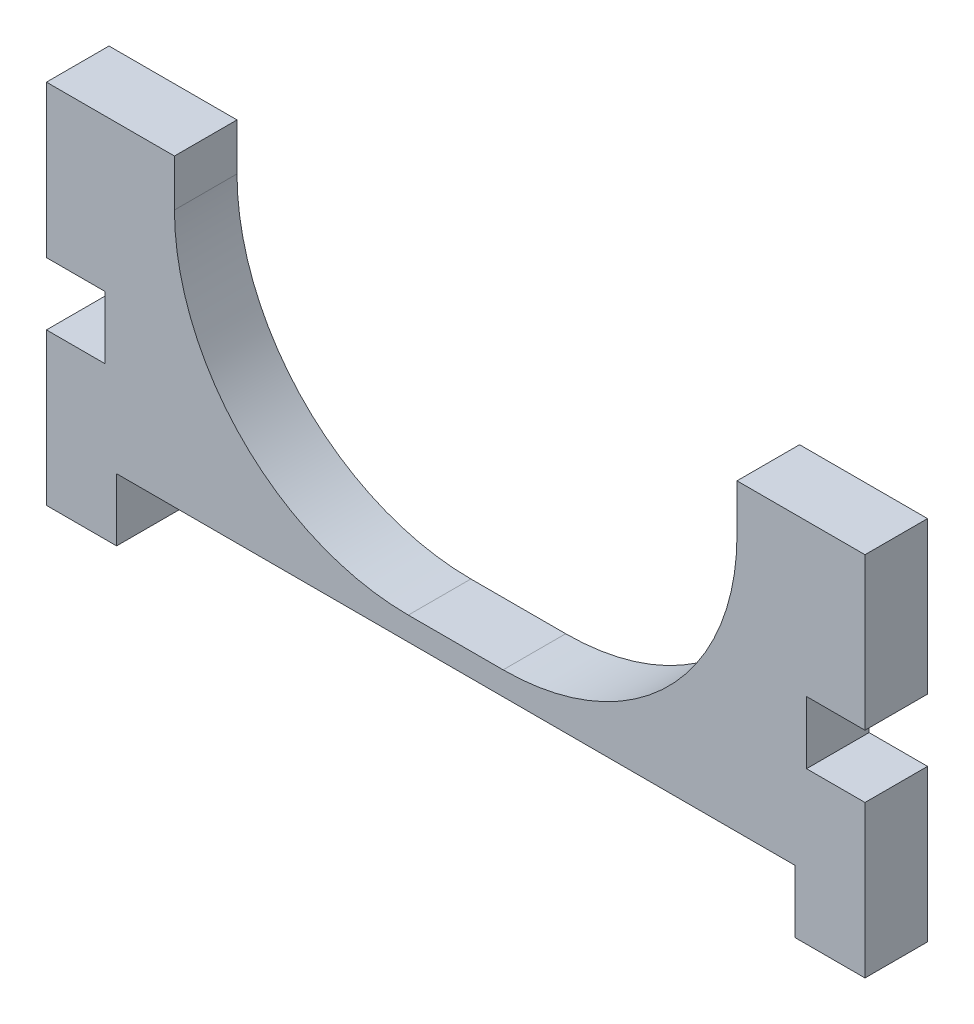
ISO-10303-21;
HEADER;
FILE_DESCRIPTION(('STEP AP214'),'2;1');
FILE_NAME('part.step','',(''),(''),'','','');
FILE_SCHEMA(('AUTOMOTIVE_DESIGN { 1 0 10303 214 1 1 1 1 }'));
ENDSEC;
DATA;
#1=APPLICATION_CONTEXT('core data for automotive mechanical design processes');
#2=APPLICATION_PROTOCOL_DEFINITION('international standard','automotive_design',2000,#1);
#3=PRODUCT_CONTEXT('',#1,'mechanical');
#4=PRODUCT('Part','Part','',(#3));
#5=PRODUCT_RELATED_PRODUCT_CATEGORY('part','',(#4));
#6=PRODUCT_DEFINITION_FORMATION('','',#4);
#7=PRODUCT_DEFINITION_CONTEXT('part definition',#1,'design');
#8=PRODUCT_DEFINITION('design','',#6,#7);
#9=PRODUCT_DEFINITION_SHAPE('','',#8);
#10=(LENGTH_UNIT() NAMED_UNIT(*) SI_UNIT(.MILLI.,.METRE.));
#11=(NAMED_UNIT(*) PLANE_ANGLE_UNIT() SI_UNIT($,.RADIAN.));
#12=(NAMED_UNIT(*) SI_UNIT($,.STERADIAN.) SOLID_ANGLE_UNIT());
#13=UNCERTAINTY_MEASURE_WITH_UNIT(LENGTH_MEASURE(1.E-05),#10,'distance_accuracy_value','');
#14=(GEOMETRIC_REPRESENTATION_CONTEXT(3) GLOBAL_UNCERTAINTY_ASSIGNED_CONTEXT((#13)) GLOBAL_UNIT_ASSIGNED_CONTEXT((#10,
#11,#12)) REPRESENTATION_CONTEXT('',''));
#15=CARTESIAN_POINT('',(0.,0.,0.));
#16=DIRECTION('',(0.,0.,1.));
#17=DIRECTION('',(1.,0.,0.));
#18=AXIS2_PLACEMENT_3D('',#15,#16,#17);
#19=CARTESIAN_POINT('',(39.055,27.35,5.35));
#20=DIRECTION('',(0.,0.,-1.));
#21=DIRECTION('',(-1.,0.,0.));
#22=AXIS2_PLACEMENT_3D('',#19,#20,#21);
#23=CYLINDRICAL_SURFACE('',#22,20.);
#24=CARTESIAN_POINT('',(39.055,27.35,0.));
#25=DIRECTION('',(0.,0.,-1.));
#26=DIRECTION('',(-1.,0.,0.));
#27=AXIS2_PLACEMENT_3D('',#24,#25,#26);
#28=CIRCLE('',#27,20.);
#29=CARTESIAN_POINT('',(59.055,27.35,0.));
#30=VERTEX_POINT('',#29);
#31=CARTESIAN_POINT('',(39.055,7.35000000000001,0.));
#32=VERTEX_POINT('',#31);
#33=EDGE_CURVE('E213',#30,#32,#28,.T.);
#34=ORIENTED_EDGE('',*,*,#33,.T.);
#35=DIRECTION('',(0.,0.,-1.));
#36=VECTOR('',#35,1.);
#37=CARTESIAN_POINT('',(39.055,7.35000000000001,5.35));
#38=LINE('',#37,#36);
#39=CARTESIAN_POINT('',(39.055,7.35000000000001,5.35));
#40=VERTEX_POINT('',#39);
#41=EDGE_CURVE('E11',#40,#32,#38,.T.);
#42=ORIENTED_EDGE('',*,*,#41,.F.);
#43=CARTESIAN_POINT('',(39.055,27.35,5.35));
#44=DIRECTION('',(0.,0.,-1.));
#45=DIRECTION('',(-1.,0.,0.));
#46=AXIS2_PLACEMENT_3D('',#43,#44,#45);
#47=CIRCLE('',#46,20.);
#48=CARTESIAN_POINT('',(59.055,27.35,5.35));
#49=VERTEX_POINT('',#48);
#50=EDGE_CURVE('E255',#49,#40,#47,.T.);
#51=ORIENTED_EDGE('',*,*,#50,.F.);
#52=DIRECTION('',(0.,0.,-1.));
#53=VECTOR('',#52,1.);
#54=CARTESIAN_POINT('',(59.055,27.35,5.35));
#55=LINE('',#54,#53);
#56=EDGE_CURVE('E209',#49,#30,#55,.T.);
#57=ORIENTED_EDGE('',*,*,#56,.T.);
#58=EDGE_LOOP('',(#34,#42,#51,#57));
#59=FACE_BOUND('',#58,.T.);
#60=ADVANCED_FACE('F33',(#59),#23,.F.);
#61=CARTESIAN_POINT('',(39.055,7.35000000000001,5.35));
#62=DIRECTION('',(0.,-1.,0.));
#63=DIRECTION('',(0.,0.,-1.));
#64=AXIS2_PLACEMENT_3D('',#61,#62,#63);
#65=PLANE('',#64);
#66=DIRECTION('',(-1.,0.,0.));
#67=VECTOR('',#66,1.);
#68=CARTESIAN_POINT('',(39.055,7.35000000000001,0.));
#69=LINE('',#68,#67);
#70=CARTESIAN_POINT('',(30.945,7.35,0.));
#71=VERTEX_POINT('',#70);
#72=EDGE_CURVE('E216',#32,#71,#69,.T.);
#73=ORIENTED_EDGE('',*,*,#72,.T.);
#74=DIRECTION('',(0.,0.,-1.));
#75=VECTOR('',#74,1.);
#76=CARTESIAN_POINT('',(30.945,7.35,5.35));
#77=LINE('',#76,#75);
#78=CARTESIAN_POINT('',(30.945,7.35,5.35));
#79=VERTEX_POINT('',#78);
#80=EDGE_CURVE('E41',#79,#71,#77,.T.);
#81=ORIENTED_EDGE('',*,*,#80,.F.);
#82=DIRECTION('',(-1.,0.,0.));
#83=VECTOR('',#82,1.);
#84=CARTESIAN_POINT('',(39.055,7.35000000000001,5.35));
#85=LINE('',#84,#83);
#86=EDGE_CURVE('E134',#40,#79,#85,.T.);
#87=ORIENTED_EDGE('',*,*,#86,.F.);
#88=ORIENTED_EDGE('',*,*,#41,.T.);
#89=EDGE_LOOP('',(#73,#81,#87,#88));
#90=FACE_BOUND('',#89,.T.);
#91=ADVANCED_FACE('F383',(#90),#65,.F.);
#92=CARTESIAN_POINT('',(30.945,27.35,5.35));
#93=DIRECTION('',(0.,0.,-1.));
#94=DIRECTION('',(-1.,0.,0.));
#95=AXIS2_PLACEMENT_3D('',#92,#93,#94);
#96=CYLINDRICAL_SURFACE('',#95,20.);
#97=CARTESIAN_POINT('',(30.945,27.35,0.));
#98=DIRECTION('',(0.,0.,-1.));
#99=DIRECTION('',(1.,0.,0.));
#100=AXIS2_PLACEMENT_3D('',#97,#98,#99);
#101=CIRCLE('',#100,20.);
#102=CARTESIAN_POINT('',(10.945,27.35,0.));
#103=VERTEX_POINT('',#102);
#104=EDGE_CURVE('E218',#71,#103,#101,.T.);
#105=ORIENTED_EDGE('',*,*,#104,.T.);
#106=DIRECTION('',(0.,0.,-1.));
#107=VECTOR('',#106,1.);
#108=CARTESIAN_POINT('',(10.945,27.35,5.35));
#109=LINE('',#108,#107);
#110=CARTESIAN_POINT('',(10.945,27.35,5.35));
#111=VERTEX_POINT('',#110);
#112=EDGE_CURVE('E304',#111,#103,#109,.T.);
#113=ORIENTED_EDGE('',*,*,#112,.F.);
#114=CARTESIAN_POINT('',(30.945,27.35,5.35));
#115=DIRECTION('',(0.,0.,-1.));
#116=DIRECTION('',(1.,0.,0.));
#117=AXIS2_PLACEMENT_3D('',#114,#115,#116);
#118=CIRCLE('',#117,20.);
#119=EDGE_CURVE('E312',#79,#111,#118,.T.);
#120=ORIENTED_EDGE('',*,*,#119,.F.);
#121=ORIENTED_EDGE('',*,*,#80,.T.);
#122=EDGE_LOOP('',(#105,#113,#120,#121));
#123=FACE_BOUND('',#122,.T.);
#124=ADVANCED_FACE('F310',(#123),#96,.F.);
#125=CARTESIAN_POINT('',(10.945,27.35,5.35));
#126=DIRECTION('',(-1.,0.,0.));
#127=DIRECTION('',(0.,0.,1.));
#128=AXIS2_PLACEMENT_3D('',#125,#126,#127);
#129=PLANE('',#128);
#130=DIRECTION('',(0.,1.,0.));
#131=VECTOR('',#130,1.);
#132=CARTESIAN_POINT('',(10.945,27.35,0.));
#133=LINE('',#132,#131);
#134=CARTESIAN_POINT('',(10.945,31.35,0.));
#135=VERTEX_POINT('',#134);
#136=EDGE_CURVE('E220',#103,#135,#133,.T.);
#137=ORIENTED_EDGE('',*,*,#136,.T.);
#138=DIRECTION('',(0.,0.,-1.));
#139=VECTOR('',#138,1.);
#140=CARTESIAN_POINT('',(10.945,31.35,5.35));
#141=LINE('',#140,#139);
#142=CARTESIAN_POINT('',(10.945,31.35,5.35));
#143=VERTEX_POINT('',#142);
#144=EDGE_CURVE('E301',#143,#135,#141,.T.);
#145=ORIENTED_EDGE('',*,*,#144,.F.);
#146=DIRECTION('',(0.,1.,0.));
#147=VECTOR('',#146,1.);
#148=CARTESIAN_POINT('',(10.945,27.35,5.35));
#149=LINE('',#148,#147);
#150=EDGE_CURVE('E330',#111,#143,#149,.T.);
#151=ORIENTED_EDGE('',*,*,#150,.F.);
#152=ORIENTED_EDGE('',*,*,#112,.T.);
#153=EDGE_LOOP('',(#137,#145,#151,#152));
#154=FACE_BOUND('',#153,.T.);
#155=ADVANCED_FACE('F321',(#154),#129,.F.);
#156=CARTESIAN_POINT('',(10.945,31.35,5.35));
#157=DIRECTION('',(0.,-1.,0.));
#158=DIRECTION('',(0.,0.,-1.));
#159=AXIS2_PLACEMENT_3D('',#156,#157,#158);
#160=PLANE('',#159);
#161=DIRECTION('',(-1.,0.,0.));
#162=VECTOR('',#161,1.);
#163=CARTESIAN_POINT('',(10.945,31.35,0.));
#164=LINE('',#163,#162);
#165=CARTESIAN_POINT('',(0.,31.35,0.));
#166=VERTEX_POINT('',#165);
#167=EDGE_CURVE('E222',#135,#166,#164,.T.);
#168=ORIENTED_EDGE('',*,*,#167,.T.);
#169=DIRECTION('',(0.,0.,-1.));
#170=VECTOR('',#169,1.);
#171=CARTESIAN_POINT('',(0.,31.35,5.35));
#172=LINE('',#171,#170);
#173=CARTESIAN_POINT('',(0.,31.35,5.35));
#174=VERTEX_POINT('',#173);
#175=EDGE_CURVE('E298',#174,#166,#172,.T.);
#176=ORIENTED_EDGE('',*,*,#175,.F.);
#177=DIRECTION('',(-1.,0.,0.));
#178=VECTOR('',#177,1.);
#179=CARTESIAN_POINT('',(10.945,31.35,5.35));
#180=LINE('',#179,#178);
#181=EDGE_CURVE('E327',#143,#174,#180,.T.);
#182=ORIENTED_EDGE('',*,*,#181,.F.);
#183=ORIENTED_EDGE('',*,*,#144,.T.);
#184=EDGE_LOOP('',(#168,#176,#182,#183));
#185=FACE_BOUND('',#184,.T.);
#186=ADVANCED_FACE('F325',(#185),#160,.F.);
#187=CARTESIAN_POINT('',(0.,31.35,5.35));
#188=DIRECTION('',(1.,0.,0.));
#189=DIRECTION('',(0.,0.,-1.));
#190=AXIS2_PLACEMENT_3D('',#187,#188,#189);
#191=PLANE('',#190);
#192=DIRECTION('',(0.,-1.,0.));
#193=VECTOR('',#192,1.);
#194=CARTESIAN_POINT('',(0.,31.35,0.));
#195=LINE('',#194,#193);
#196=CARTESIAN_POINT('',(0.,18.35,0.));
#197=VERTEX_POINT('',#196);
#198=EDGE_CURVE('E224',#166,#197,#195,.T.);
#199=ORIENTED_EDGE('',*,*,#198,.T.);
#200=DIRECTION('',(0.,0.,-1.));
#201=VECTOR('',#200,1.);
#202=CARTESIAN_POINT('',(0.,18.35,5.35));
#203=LINE('',#202,#201);
#204=CARTESIAN_POINT('',(0.,18.35,5.35));
#205=VERTEX_POINT('',#204);
#206=EDGE_CURVE('E295',#205,#197,#203,.T.);
#207=ORIENTED_EDGE('',*,*,#206,.F.);
#208=DIRECTION('',(0.,-1.,0.));
#209=VECTOR('',#208,1.);
#210=CARTESIAN_POINT('',(0.,31.35,5.35));
#211=LINE('',#210,#209);
#212=EDGE_CURVE('E329',#174,#205,#211,.T.);
#213=ORIENTED_EDGE('',*,*,#212,.F.);
#214=ORIENTED_EDGE('',*,*,#175,.T.);
#215=EDGE_LOOP('',(#199,#207,#213,#214));
#216=FACE_BOUND('',#215,.T.);
#217=ADVANCED_FACE('F396',(#216),#191,.F.);
#218=CARTESIAN_POINT('',(0.,18.35,5.35));
#219=DIRECTION('',(0.,1.,0.));
#220=DIRECTION('',(0.,0.,1.));
#221=AXIS2_PLACEMENT_3D('',#218,#219,#220);
#222=PLANE('',#221);
#223=DIRECTION('',(1.,0.,0.));
#224=VECTOR('',#223,1.);
#225=CARTESIAN_POINT('',(0.,18.35,0.));
#226=LINE('',#225,#224);
#227=CARTESIAN_POINT('',(5.,18.35,0.));
#228=VERTEX_POINT('',#227);
#229=EDGE_CURVE('E226',#197,#228,#226,.T.);
#230=ORIENTED_EDGE('',*,*,#229,.T.);
#231=DIRECTION('',(0.,0.,-1.));
#232=VECTOR('',#231,1.);
#233=CARTESIAN_POINT('',(5.,18.35,5.35));
#234=LINE('',#233,#232);
#235=CARTESIAN_POINT('',(5.,18.35,5.35));
#236=VERTEX_POINT('',#235);
#237=EDGE_CURVE('E292',#236,#228,#234,.T.);
#238=ORIENTED_EDGE('',*,*,#237,.F.);
#239=DIRECTION('',(1.,0.,0.));
#240=VECTOR('',#239,1.);
#241=CARTESIAN_POINT('',(0.,18.35,5.35));
#242=LINE('',#241,#240);
#243=EDGE_CURVE('E332',#205,#236,#242,.T.);
#244=ORIENTED_EDGE('',*,*,#243,.F.);
#245=ORIENTED_EDGE('',*,*,#206,.T.);
#246=EDGE_LOOP('',(#230,#238,#244,#245));
#247=FACE_BOUND('',#246,.T.);
#248=ADVANCED_FACE('F399',(#247),#222,.F.);
#249=CARTESIAN_POINT('',(5.,18.35,5.35));
#250=DIRECTION('',(1.,0.,0.));
#251=DIRECTION('',(0.,0.,-1.));
#252=AXIS2_PLACEMENT_3D('',#249,#250,#251);
#253=PLANE('',#252);
#254=DIRECTION('',(0.,-1.,0.));
#255=VECTOR('',#254,1.);
#256=CARTESIAN_POINT('',(5.,18.35,0.));
#257=LINE('',#256,#255);
#258=CARTESIAN_POINT('',(5.,13.,0.));
#259=VERTEX_POINT('',#258);
#260=EDGE_CURVE('E228',#228,#259,#257,.T.);
#261=ORIENTED_EDGE('',*,*,#260,.T.);
#262=DIRECTION('',(0.,0.,-1.));
#263=VECTOR('',#262,1.);
#264=CARTESIAN_POINT('',(5.,13.,5.35));
#265=LINE('',#264,#263);
#266=CARTESIAN_POINT('',(5.,13.,5.35));
#267=VERTEX_POINT('',#266);
#268=EDGE_CURVE('E289',#267,#259,#265,.T.);
#269=ORIENTED_EDGE('',*,*,#268,.F.);
#270=DIRECTION('',(0.,-1.,0.));
#271=VECTOR('',#270,1.);
#272=CARTESIAN_POINT('',(5.,18.35,5.35));
#273=LINE('',#272,#271);
#274=EDGE_CURVE('E338',#236,#267,#273,.T.);
#275=ORIENTED_EDGE('',*,*,#274,.F.);
#276=ORIENTED_EDGE('',*,*,#237,.T.);
#277=EDGE_LOOP('',(#261,#269,#275,#276));
#278=FACE_BOUND('',#277,.T.);
#279=ADVANCED_FACE('F403',(#278),#253,.F.);
#280=CARTESIAN_POINT('',(5.,13.,5.35));
#281=DIRECTION('',(0.,-1.,0.));
#282=DIRECTION('',(0.,0.,-1.));
#283=AXIS2_PLACEMENT_3D('',#280,#281,#282);
#284=PLANE('',#283);
#285=DIRECTION('',(-1.,0.,0.));
#286=VECTOR('',#285,1.);
#287=CARTESIAN_POINT('',(5.,13.,0.));
#288=LINE('',#287,#286);
#289=CARTESIAN_POINT('',(0.,13.,0.));
#290=VERTEX_POINT('',#289);
#291=EDGE_CURVE('E230',#259,#290,#288,.T.);
#292=ORIENTED_EDGE('',*,*,#291,.T.);
#293=DIRECTION('',(0.,0.,-1.));
#294=VECTOR('',#293,1.);
#295=CARTESIAN_POINT('',(0.,13.,5.35));
#296=LINE('',#295,#294);
#297=CARTESIAN_POINT('',(0.,13.,5.35));
#298=VERTEX_POINT('',#297);
#299=EDGE_CURVE('E286',#298,#290,#296,.T.);
#300=ORIENTED_EDGE('',*,*,#299,.F.);
#301=DIRECTION('',(-1.,0.,0.));
#302=VECTOR('',#301,1.);
#303=CARTESIAN_POINT('',(5.,13.,5.35));
#304=LINE('',#303,#302);
#305=EDGE_CURVE('E340',#267,#298,#304,.T.);
#306=ORIENTED_EDGE('',*,*,#305,.F.);
#307=ORIENTED_EDGE('',*,*,#268,.T.);
#308=EDGE_LOOP('',(#292,#300,#306,#307));
#309=FACE_BOUND('',#308,.T.);
#310=ADVANCED_FACE('F407',(#309),#284,.F.);
#311=CARTESIAN_POINT('',(0.,13.,5.35));
#312=DIRECTION('',(1.,0.,0.));
#313=DIRECTION('',(0.,0.,-1.));
#314=AXIS2_PLACEMENT_3D('',#311,#312,#313);
#315=PLANE('',#314);
#316=DIRECTION('',(0.,-1.,0.));
#317=VECTOR('',#316,1.);
#318=CARTESIAN_POINT('',(0.,13.,0.));
#319=LINE('',#318,#317);
#320=CARTESIAN_POINT('',(0.,0.,0.));
#321=VERTEX_POINT('',#320);
#322=EDGE_CURVE('E232',#290,#321,#319,.T.);
#323=ORIENTED_EDGE('',*,*,#322,.T.);
#324=DIRECTION('',(0.,0.,-1.));
#325=VECTOR('',#324,1.);
#326=CARTESIAN_POINT('',(0.,0.,5.35));
#327=LINE('',#326,#325);
#328=CARTESIAN_POINT('',(0.,0.,5.35));
#329=VERTEX_POINT('',#328);
#330=EDGE_CURVE('E283',#329,#321,#327,.T.);
#331=ORIENTED_EDGE('',*,*,#330,.F.);
#332=DIRECTION('',(0.,-1.,0.));
#333=VECTOR('',#332,1.);
#334=CARTESIAN_POINT('',(0.,13.,5.35));
#335=LINE('',#334,#333);
#336=EDGE_CURVE('E342',#298,#329,#335,.T.);
#337=ORIENTED_EDGE('',*,*,#336,.F.);
#338=ORIENTED_EDGE('',*,*,#299,.T.);
#339=EDGE_LOOP('',(#323,#331,#337,#338));
#340=FACE_BOUND('',#339,.T.);
#341=ADVANCED_FACE('F411',(#340),#315,.F.);
#342=CARTESIAN_POINT('',(0.,0.,5.35));
#343=DIRECTION('',(0.,1.,0.));
#344=DIRECTION('',(0.,0.,1.));
#345=AXIS2_PLACEMENT_3D('',#342,#343,#344);
#346=PLANE('',#345);
#347=DIRECTION('',(1.,0.,0.));
#348=VECTOR('',#347,1.);
#349=CARTESIAN_POINT('',(0.,0.,0.));
#350=LINE('',#349,#348);
#351=CARTESIAN_POINT('',(6.,0.,0.));
#352=VERTEX_POINT('',#351);
#353=EDGE_CURVE('E234',#321,#352,#350,.T.);
#354=ORIENTED_EDGE('',*,*,#353,.T.);
#355=DIRECTION('',(0.,0.,-1.));
#356=VECTOR('',#355,1.);
#357=CARTESIAN_POINT('',(6.,0.,5.35));
#358=LINE('',#357,#356);
#359=CARTESIAN_POINT('',(6.,0.,5.35));
#360=VERTEX_POINT('',#359);
#361=EDGE_CURVE('E280',#360,#352,#358,.T.);
#362=ORIENTED_EDGE('',*,*,#361,.F.);
#363=DIRECTION('',(1.,0.,0.));
#364=VECTOR('',#363,1.);
#365=CARTESIAN_POINT('',(0.,0.,5.35));
#366=LINE('',#365,#364);
#367=EDGE_CURVE('E344',#329,#360,#366,.T.);
#368=ORIENTED_EDGE('',*,*,#367,.F.);
#369=ORIENTED_EDGE('',*,*,#330,.T.);
#370=EDGE_LOOP('',(#354,#362,#368,#369));
#371=FACE_BOUND('',#370,.T.);
#372=ADVANCED_FACE('F415',(#371),#346,.F.);
#373=CARTESIAN_POINT('',(6.,0.,5.35));
#374=DIRECTION('',(-1.,0.,0.));
#375=DIRECTION('',(0.,0.,1.));
#376=AXIS2_PLACEMENT_3D('',#373,#374,#375);
#377=PLANE('',#376);
#378=DIRECTION('',(0.,1.,0.));
#379=VECTOR('',#378,1.);
#380=CARTESIAN_POINT('',(6.,0.,0.));
#381=LINE('',#380,#379);
#382=CARTESIAN_POINT('',(6.,5.35000000000001,0.));
#383=VERTEX_POINT('',#382);
#384=EDGE_CURVE('E236',#352,#383,#381,.T.);
#385=ORIENTED_EDGE('',*,*,#384,.T.);
#386=DIRECTION('',(0.,0.,-1.));
#387=VECTOR('',#386,1.);
#388=CARTESIAN_POINT('',(6.,5.35000000000001,5.35));
#389=LINE('',#388,#387);
#390=CARTESIAN_POINT('',(6.,5.35000000000001,5.35));
#391=VERTEX_POINT('',#390);
#392=EDGE_CURVE('E277',#391,#383,#389,.T.);
#393=ORIENTED_EDGE('',*,*,#392,.F.);
#394=DIRECTION('',(0.,1.,0.));
#395=VECTOR('',#394,1.);
#396=CARTESIAN_POINT('',(6.,0.,5.35));
#397=LINE('',#396,#395);
#398=EDGE_CURVE('E346',#360,#391,#397,.T.);
#399=ORIENTED_EDGE('',*,*,#398,.F.);
#400=ORIENTED_EDGE('',*,*,#361,.T.);
#401=EDGE_LOOP('',(#385,#393,#399,#400));
#402=FACE_BOUND('',#401,.T.);
#403=ADVANCED_FACE('F419',(#402),#377,.F.);
#404=CARTESIAN_POINT('',(6.,5.35000000000001,5.35));
#405=DIRECTION('',(0.,1.,0.));
#406=DIRECTION('',(0.,0.,1.));
#407=AXIS2_PLACEMENT_3D('',#404,#405,#406);
#408=PLANE('',#407);
#409=DIRECTION('',(1.,0.,0.));
#410=VECTOR('',#409,1.);
#411=CARTESIAN_POINT('',(6.,5.35000000000001,0.));
#412=LINE('',#411,#410);
#413=CARTESIAN_POINT('',(64.,5.35000000000001,0.));
#414=VERTEX_POINT('',#413);
#415=EDGE_CURVE('E238',#383,#414,#412,.T.);
#416=ORIENTED_EDGE('',*,*,#415,.T.);
#417=DIRECTION('',(0.,0.,-1.));
#418=VECTOR('',#417,1.);
#419=CARTESIAN_POINT('',(64.,5.35000000000001,5.35));
#420=LINE('',#419,#418);
#421=CARTESIAN_POINT('',(64.,5.35000000000001,5.35));
#422=VERTEX_POINT('',#421);
#423=EDGE_CURVE('E274',#422,#414,#420,.T.);
#424=ORIENTED_EDGE('',*,*,#423,.F.);
#425=DIRECTION('',(1.,0.,0.));
#426=VECTOR('',#425,1.);
#427=CARTESIAN_POINT('',(6.,5.35000000000001,5.35));
#428=LINE('',#427,#426);
#429=EDGE_CURVE('E348',#391,#422,#428,.T.);
#430=ORIENTED_EDGE('',*,*,#429,.F.);
#431=ORIENTED_EDGE('',*,*,#392,.T.);
#432=EDGE_LOOP('',(#416,#424,#430,#431));
#433=FACE_BOUND('',#432,.T.);
#434=ADVANCED_FACE('F423',(#433),#408,.F.);
#435=CARTESIAN_POINT('',(64.,0.,5.35));
#436=DIRECTION('',(1.,0.,0.));
#437=DIRECTION('',(0.,0.,-1.));
#438=AXIS2_PLACEMENT_3D('',#435,#436,#437);
#439=PLANE('',#438);
#440=DIRECTION('',(0.,-1.,0.));
#441=VECTOR('',#440,1.);
#442=CARTESIAN_POINT('',(64.,0.,0.));
#443=LINE('',#442,#441);
#444=CARTESIAN_POINT('',(64.,0.,0.));
#445=VERTEX_POINT('',#444);
#446=EDGE_CURVE('E240',#414,#445,#443,.T.);
#447=ORIENTED_EDGE('',*,*,#446,.T.);
#448=DIRECTION('',(0.,0.,-1.));
#449=VECTOR('',#448,1.);
#450=CARTESIAN_POINT('',(64.,0.,5.35));
#451=LINE('',#450,#449);
#452=CARTESIAN_POINT('',(64.,0.,5.35));
#453=VERTEX_POINT('',#452);
#454=EDGE_CURVE('E271',#453,#445,#451,.T.);
#455=ORIENTED_EDGE('',*,*,#454,.F.);
#456=DIRECTION('',(0.,-1.,0.));
#457=VECTOR('',#456,1.);
#458=CARTESIAN_POINT('',(64.,0.,5.35));
#459=LINE('',#458,#457);
#460=EDGE_CURVE('E350',#422,#453,#459,.T.);
#461=ORIENTED_EDGE('',*,*,#460,.F.);
#462=ORIENTED_EDGE('',*,*,#423,.T.);
#463=EDGE_LOOP('',(#447,#455,#461,#462));
#464=FACE_BOUND('',#463,.T.);
#465=ADVANCED_FACE('F427',(#464),#439,.F.);
#466=CARTESIAN_POINT('',(70.,0.,5.35));
#467=DIRECTION('',(0.,1.,0.));
#468=DIRECTION('',(0.,0.,1.));
#469=AXIS2_PLACEMENT_3D('',#466,#467,#468);
#470=PLANE('',#469);
#471=DIRECTION('',(1.,0.,0.));
#472=VECTOR('',#471,1.);
#473=CARTESIAN_POINT('',(70.,0.,0.));
#474=LINE('',#473,#472);
#475=CARTESIAN_POINT('',(70.,0.,0.));
#476=VERTEX_POINT('',#475);
#477=EDGE_CURVE('E242',#445,#476,#474,.T.);
#478=ORIENTED_EDGE('',*,*,#477,.T.);
#479=DIRECTION('',(0.,0.,-1.));
#480=VECTOR('',#479,1.);
#481=CARTESIAN_POINT('',(70.,0.,5.35));
#482=LINE('',#481,#480);
#483=CARTESIAN_POINT('',(70.,0.,5.35));
#484=VERTEX_POINT('',#483);
#485=EDGE_CURVE('E268',#484,#476,#482,.T.);
#486=ORIENTED_EDGE('',*,*,#485,.F.);
#487=DIRECTION('',(1.,0.,0.));
#488=VECTOR('',#487,1.);
#489=CARTESIAN_POINT('',(70.,0.,5.35));
#490=LINE('',#489,#488);
#491=EDGE_CURVE('E352',#453,#484,#490,.T.);
#492=ORIENTED_EDGE('',*,*,#491,.F.);
#493=ORIENTED_EDGE('',*,*,#454,.T.);
#494=EDGE_LOOP('',(#478,#486,#492,#493));
#495=FACE_BOUND('',#494,.T.);
#496=ADVANCED_FACE('F431',(#495),#470,.F.);
#497=CARTESIAN_POINT('',(70.,13.,5.35));
#498=DIRECTION('',(-1.,0.,0.));
#499=DIRECTION('',(0.,0.,1.));
#500=AXIS2_PLACEMENT_3D('',#497,#498,#499);
#501=PLANE('',#500);
#502=DIRECTION('',(0.,1.,0.));
#503=VECTOR('',#502,1.);
#504=CARTESIAN_POINT('',(70.,13.,0.));
#505=LINE('',#504,#503);
#506=CARTESIAN_POINT('',(70.,13.,0.));
#507=VERTEX_POINT('',#506);
#508=EDGE_CURVE('E244',#476,#507,#505,.T.);
#509=ORIENTED_EDGE('',*,*,#508,.T.);
#510=DIRECTION('',(0.,0.,-1.));
#511=VECTOR('',#510,1.);
#512=CARTESIAN_POINT('',(70.,13.,5.35));
#513=LINE('',#512,#511);
#514=CARTESIAN_POINT('',(70.,13.,5.35));
#515=VERTEX_POINT('',#514);
#516=EDGE_CURVE('E265',#515,#507,#513,.T.);
#517=ORIENTED_EDGE('',*,*,#516,.F.);
#518=DIRECTION('',(0.,1.,0.));
#519=VECTOR('',#518,1.);
#520=CARTESIAN_POINT('',(70.,13.,5.35));
#521=LINE('',#520,#519);
#522=EDGE_CURVE('E354',#484,#515,#521,.T.);
#523=ORIENTED_EDGE('',*,*,#522,.F.);
#524=ORIENTED_EDGE('',*,*,#485,.T.);
#525=EDGE_LOOP('',(#509,#517,#523,#524));
#526=FACE_BOUND('',#525,.T.);
#527=ADVANCED_FACE('F435',(#526),#501,.F.);
#528=CARTESIAN_POINT('',(65.,13.,5.35));
#529=DIRECTION('',(0.,-1.,0.));
#530=DIRECTION('',(0.,0.,-1.));
#531=AXIS2_PLACEMENT_3D('',#528,#529,#530);
#532=PLANE('',#531);
#533=DIRECTION('',(-1.,0.,0.));
#534=VECTOR('',#533,1.);
#535=CARTESIAN_POINT('',(65.,13.,0.));
#536=LINE('',#535,#534);
#537=CARTESIAN_POINT('',(65.,13.,0.));
#538=VERTEX_POINT('',#537);
#539=EDGE_CURVE('E246',#507,#538,#536,.T.);
#540=ORIENTED_EDGE('',*,*,#539,.T.);
#541=DIRECTION('',(0.,0.,-1.));
#542=VECTOR('',#541,1.);
#543=CARTESIAN_POINT('',(65.,13.,5.35));
#544=LINE('',#543,#542);
#545=CARTESIAN_POINT('',(65.,13.,5.35));
#546=VERTEX_POINT('',#545);
#547=EDGE_CURVE('E262',#546,#538,#544,.T.);
#548=ORIENTED_EDGE('',*,*,#547,.F.);
#549=DIRECTION('',(-1.,0.,0.));
#550=VECTOR('',#549,1.);
#551=CARTESIAN_POINT('',(65.,13.,5.35));
#552=LINE('',#551,#550);
#553=EDGE_CURVE('E356',#515,#546,#552,.T.);
#554=ORIENTED_EDGE('',*,*,#553,.F.);
#555=ORIENTED_EDGE('',*,*,#516,.T.);
#556=EDGE_LOOP('',(#540,#548,#554,#555));
#557=FACE_BOUND('',#556,.T.);
#558=ADVANCED_FACE('F439',(#557),#532,.F.);
#559=CARTESIAN_POINT('',(65.,18.35,5.35));
#560=DIRECTION('',(-1.,0.,0.));
#561=DIRECTION('',(0.,0.,1.));
#562=AXIS2_PLACEMENT_3D('',#559,#560,#561);
#563=PLANE('',#562);
#564=DIRECTION('',(0.,1.,0.));
#565=VECTOR('',#564,1.);
#566=CARTESIAN_POINT('',(65.,18.35,0.));
#567=LINE('',#566,#565);
#568=CARTESIAN_POINT('',(65.,18.35,0.));
#569=VERTEX_POINT('',#568);
#570=EDGE_CURVE('E248',#538,#569,#567,.T.);
#571=ORIENTED_EDGE('',*,*,#570,.T.);
#572=DIRECTION('',(0.,0.,-1.));
#573=VECTOR('',#572,1.);
#574=CARTESIAN_POINT('',(65.,18.35,5.35));
#575=LINE('',#574,#573);
#576=CARTESIAN_POINT('',(65.,18.35,5.35));
#577=VERTEX_POINT('',#576);
#578=EDGE_CURVE('E259',#577,#569,#575,.T.);
#579=ORIENTED_EDGE('',*,*,#578,.F.);
#580=DIRECTION('',(0.,1.,0.));
#581=VECTOR('',#580,1.);
#582=CARTESIAN_POINT('',(65.,18.35,5.35));
#583=LINE('',#582,#581);
#584=EDGE_CURVE('E358',#546,#577,#583,.T.);
#585=ORIENTED_EDGE('',*,*,#584,.F.);
#586=ORIENTED_EDGE('',*,*,#547,.T.);
#587=EDGE_LOOP('',(#571,#579,#585,#586));
#588=FACE_BOUND('',#587,.T.);
#589=ADVANCED_FACE('F364',(#588),#563,.F.);
#590=CARTESIAN_POINT('',(70.,18.35,5.35));
#591=DIRECTION('',(0.,1.,0.));
#592=DIRECTION('',(0.,0.,1.));
#593=AXIS2_PLACEMENT_3D('',#590,#591,#592);
#594=PLANE('',#593);
#595=DIRECTION('',(1.,0.,0.));
#596=VECTOR('',#595,1.);
#597=CARTESIAN_POINT('',(70.,18.35,0.));
#598=LINE('',#597,#596);
#599=CARTESIAN_POINT('',(70.,18.35,0.));
#600=VERTEX_POINT('',#599);
#601=EDGE_CURVE('E250',#569,#600,#598,.T.);
#602=ORIENTED_EDGE('',*,*,#601,.T.);
#603=DIRECTION('',(0.,0.,-1.));
#604=VECTOR('',#603,1.);
#605=CARTESIAN_POINT('',(70.,18.35,5.35));
#606=LINE('',#605,#604);
#607=CARTESIAN_POINT('',(70.,18.35,5.35));
#608=VERTEX_POINT('',#607);
#609=EDGE_CURVE('E204',#608,#600,#606,.T.);
#610=ORIENTED_EDGE('',*,*,#609,.F.);
#611=DIRECTION('',(1.,0.,0.));
#612=VECTOR('',#611,1.);
#613=CARTESIAN_POINT('',(70.,18.35,5.35));
#614=LINE('',#613,#612);
#615=EDGE_CURVE('E195',#577,#608,#614,.T.);
#616=ORIENTED_EDGE('',*,*,#615,.F.);
#617=ORIENTED_EDGE('',*,*,#578,.T.);
#618=EDGE_LOOP('',(#602,#610,#616,#617));
#619=FACE_BOUND('',#618,.T.);
#620=ADVANCED_FACE('F368',(#619),#594,.F.);
#621=CARTESIAN_POINT('',(70.,31.35,5.35));
#622=DIRECTION('',(-1.,0.,0.));
#623=DIRECTION('',(0.,0.,1.));
#624=AXIS2_PLACEMENT_3D('',#621,#622,#623);
#625=PLANE('',#624);
#626=DIRECTION('',(0.,1.,0.));
#627=VECTOR('',#626,1.);
#628=CARTESIAN_POINT('',(70.,31.35,0.));
#629=LINE('',#628,#627);
#630=CARTESIAN_POINT('',(70.,31.35,0.));
#631=VERTEX_POINT('',#630);
#632=EDGE_CURVE('E203',#600,#631,#629,.T.);
#633=ORIENTED_EDGE('',*,*,#632,.T.);
#634=DIRECTION('',(0.,0.,-1.));
#635=VECTOR('',#634,1.);
#636=CARTESIAN_POINT('',(70.,31.35,5.35));
#637=LINE('',#636,#635);
#638=CARTESIAN_POINT('',(70.,31.35,5.35));
#639=VERTEX_POINT('',#638);
#640=EDGE_CURVE('E200',#639,#631,#637,.T.);
#641=ORIENTED_EDGE('',*,*,#640,.F.);
#642=DIRECTION('',(0.,1.,0.));
#643=VECTOR('',#642,1.);
#644=CARTESIAN_POINT('',(70.,31.35,5.35));
#645=LINE('',#644,#643);
#646=EDGE_CURVE('E189',#608,#639,#645,.T.);
#647=ORIENTED_EDGE('',*,*,#646,.F.);
#648=ORIENTED_EDGE('',*,*,#609,.T.);
#649=EDGE_LOOP('',(#633,#641,#647,#648));
#650=FACE_BOUND('',#649,.T.);
#651=ADVANCED_FACE('F201',(#650),#625,.F.);
#652=CARTESIAN_POINT('',(59.055,31.35,5.35));
#653=DIRECTION('',(0.,-1.,0.));
#654=DIRECTION('',(0.,0.,-1.));
#655=AXIS2_PLACEMENT_3D('',#652,#653,#654);
#656=PLANE('',#655);
#657=DIRECTION('',(-1.,0.,0.));
#658=VECTOR('',#657,1.);
#659=CARTESIAN_POINT('',(59.055,31.35,0.));
#660=LINE('',#659,#658);
#661=CARTESIAN_POINT('',(59.055,31.35,0.));
#662=VERTEX_POINT('',#661);
#663=EDGE_CURVE('E120',#631,#662,#660,.T.);
#664=ORIENTED_EDGE('',*,*,#663,.T.);
#665=DIRECTION('',(0.,0.,-1.));
#666=VECTOR('',#665,1.);
#667=CARTESIAN_POINT('',(59.055,31.35,5.35));
#668=LINE('',#667,#666);
#669=CARTESIAN_POINT('',(59.055,31.35,5.35));
#670=VERTEX_POINT('',#669);
#671=EDGE_CURVE('E205',#670,#662,#668,.T.);
#672=ORIENTED_EDGE('',*,*,#671,.F.);
#673=DIRECTION('',(-1.,0.,0.));
#674=VECTOR('',#673,1.);
#675=CARTESIAN_POINT('',(59.055,31.35,5.35));
#676=LINE('',#675,#674);
#677=EDGE_CURVE('E193',#639,#670,#676,.T.);
#678=ORIENTED_EDGE('',*,*,#677,.F.);
#679=ORIENTED_EDGE('',*,*,#640,.T.);
#680=EDGE_LOOP('',(#664,#672,#678,#679));
#681=FACE_BOUND('',#680,.T.);
#682=ADVANCED_FACE('F207',(#681),#656,.F.);
#683=CARTESIAN_POINT('',(59.055,27.35,5.35));
#684=DIRECTION('',(1.,0.,0.));
#685=DIRECTION('',(0.,0.,-1.));
#686=AXIS2_PLACEMENT_3D('',#683,#684,#685);
#687=PLANE('',#686);
#688=DIRECTION('',(0.,-1.,0.));
#689=VECTOR('',#688,1.);
#690=CARTESIAN_POINT('',(59.055,27.35,0.));
#691=LINE('',#690,#689);
#692=EDGE_CURVE('E126',#662,#30,#691,.T.);
#693=ORIENTED_EDGE('',*,*,#692,.T.);
#694=ORIENTED_EDGE('',*,*,#56,.F.);
#695=DIRECTION('',(0.,-1.,0.));
#696=VECTOR('',#695,1.);
#697=CARTESIAN_POINT('',(59.055,27.35,5.35));
#698=LINE('',#697,#696);
#699=EDGE_CURVE('E49',#670,#49,#698,.T.);
#700=ORIENTED_EDGE('',*,*,#699,.F.);
#701=ORIENTED_EDGE('',*,*,#671,.T.);
#702=EDGE_LOOP('',(#693,#694,#700,#701));
#703=FACE_BOUND('',#702,.T.);
#704=ADVANCED_FACE('F372',(#703),#687,.F.);
#705=CARTESIAN_POINT('',(39.055,27.35,5.35));
#706=DIRECTION('',(0.,0.,-1.));
#707=DIRECTION('',(-1.,0.,0.));
#708=AXIS2_PLACEMENT_3D('',#705,#706,#707);
#709=PLANE('',#708);
#710=ORIENTED_EDGE('',*,*,#50,.T.);
#711=ORIENTED_EDGE('',*,*,#86,.T.);
#712=ORIENTED_EDGE('',*,*,#119,.T.);
#713=ORIENTED_EDGE('',*,*,#150,.T.);
#714=ORIENTED_EDGE('',*,*,#181,.T.);
#715=ORIENTED_EDGE('',*,*,#212,.T.);
#716=ORIENTED_EDGE('',*,*,#243,.T.);
#717=ORIENTED_EDGE('',*,*,#274,.T.);
#718=ORIENTED_EDGE('',*,*,#305,.T.);
#719=ORIENTED_EDGE('',*,*,#336,.T.);
#720=ORIENTED_EDGE('',*,*,#367,.T.);
#721=ORIENTED_EDGE('',*,*,#398,.T.);
#722=ORIENTED_EDGE('',*,*,#429,.T.);
#723=ORIENTED_EDGE('',*,*,#460,.T.);
#724=ORIENTED_EDGE('',*,*,#491,.T.);
#725=ORIENTED_EDGE('',*,*,#522,.T.);
#726=ORIENTED_EDGE('',*,*,#553,.T.);
#727=ORIENTED_EDGE('',*,*,#584,.T.);
#728=ORIENTED_EDGE('',*,*,#615,.T.);
#729=ORIENTED_EDGE('',*,*,#646,.T.);
#730=ORIENTED_EDGE('',*,*,#677,.T.);
#731=ORIENTED_EDGE('',*,*,#699,.T.);
#732=EDGE_LOOP('',(#710,#711,#712,#713,#714,#715,#716,#717,#718,#719,#720,#721,#722,#723,#724,
#725,#726,#727,#728,#729,#730,#731));
#733=FACE_BOUND('',#732,.T.);
#734=ADVANCED_FACE('F191',(#733),#709,.F.);
#735=CARTESIAN_POINT('',(39.055,27.35,0.));
#736=DIRECTION('',(0.,0.,-1.));
#737=DIRECTION('',(-1.,0.,0.));
#738=AXIS2_PLACEMENT_3D('',#735,#736,#737);
#739=PLANE('',#738);
#740=ORIENTED_EDGE('',*,*,#33,.F.);
#741=ORIENTED_EDGE('',*,*,#692,.F.);
#742=ORIENTED_EDGE('',*,*,#663,.F.);
#743=ORIENTED_EDGE('',*,*,#632,.F.);
#744=ORIENTED_EDGE('',*,*,#601,.F.);
#745=ORIENTED_EDGE('',*,*,#570,.F.);
#746=ORIENTED_EDGE('',*,*,#539,.F.);
#747=ORIENTED_EDGE('',*,*,#508,.F.);
#748=ORIENTED_EDGE('',*,*,#477,.F.);
#749=ORIENTED_EDGE('',*,*,#446,.F.);
#750=ORIENTED_EDGE('',*,*,#415,.F.);
#751=ORIENTED_EDGE('',*,*,#384,.F.);
#752=ORIENTED_EDGE('',*,*,#353,.F.);
#753=ORIENTED_EDGE('',*,*,#322,.F.);
#754=ORIENTED_EDGE('',*,*,#291,.F.);
#755=ORIENTED_EDGE('',*,*,#260,.F.);
#756=ORIENTED_EDGE('',*,*,#229,.F.);
#757=ORIENTED_EDGE('',*,*,#198,.F.);
#758=ORIENTED_EDGE('',*,*,#167,.F.);
#759=ORIENTED_EDGE('',*,*,#136,.F.);
#760=ORIENTED_EDGE('',*,*,#104,.F.);
#761=ORIENTED_EDGE('',*,*,#72,.F.);
#762=EDGE_LOOP('',(#740,#741,#742,#743,#744,#745,#746,#747,#748,#749,#750,#751,#752,#753,#754,
#755,#756,#757,#758,#759,#760,#761));
#763=FACE_BOUND('',#762,.T.);
#764=ADVANCED_FACE('F316',(#763),#739,.T.);
#765=CLOSED_SHELL('',(#60,#91,#124,#155,#186,#217,#248,#279,#310,#341,#372,#403,#434,#465,#496,
#527,#558,#589,#620,#651,#682,#704,#734,#764));
#766=MANIFOLD_SOLID_BREP('B2',#765);
#767=ADVANCED_BREP_SHAPE_REPRESENTATION('',(#18,#766),#14);
#768=SHAPE_DEFINITION_REPRESENTATION(#9,#767);
ENDSEC;
END-ISO-10303-21;
